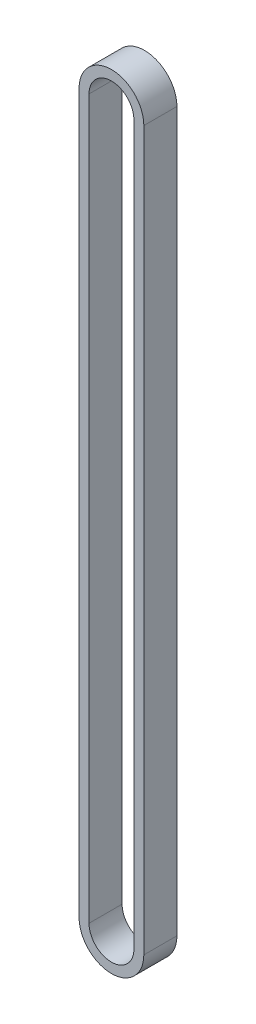
ISO-10303-21;
HEADER;
FILE_DESCRIPTION(('STEP AP214'),'2;1');
FILE_NAME('part.step','',(''),(''),'','','');
FILE_SCHEMA(('AUTOMOTIVE_DESIGN { 1 0 10303 214 1 1 1 1 }'));
ENDSEC;
DATA;
#1=APPLICATION_CONTEXT('core data for automotive mechanical design processes');
#2=APPLICATION_PROTOCOL_DEFINITION('international standard','automotive_design',2000,#1);
#3=PRODUCT_CONTEXT('',#1,'mechanical');
#4=PRODUCT('Part','Part','',(#3));
#5=PRODUCT_RELATED_PRODUCT_CATEGORY('part','',(#4));
#6=PRODUCT_DEFINITION_FORMATION('','',#4);
#7=PRODUCT_DEFINITION_CONTEXT('part definition',#1,'design');
#8=PRODUCT_DEFINITION('design','',#6,#7);
#9=PRODUCT_DEFINITION_SHAPE('','',#8);
#10=(LENGTH_UNIT() NAMED_UNIT(*) SI_UNIT(.MILLI.,.METRE.));
#11=(NAMED_UNIT(*) PLANE_ANGLE_UNIT() SI_UNIT($,.RADIAN.));
#12=(NAMED_UNIT(*) SI_UNIT($,.STERADIAN.) SOLID_ANGLE_UNIT());
#13=UNCERTAINTY_MEASURE_WITH_UNIT(LENGTH_MEASURE(1.E-05),#10,'distance_accuracy_value','');
#14=(GEOMETRIC_REPRESENTATION_CONTEXT(3) GLOBAL_UNCERTAINTY_ASSIGNED_CONTEXT((#13)) GLOBAL_UNIT_ASSIGNED_CONTEXT((#10,
#11,#12)) REPRESENTATION_CONTEXT('',''));
#15=CARTESIAN_POINT('',(0.,0.,0.));
#16=DIRECTION('',(0.,0.,1.));
#17=DIRECTION('',(1.,0.,0.));
#18=AXIS2_PLACEMENT_3D('',#15,#16,#17);
#19=CARTESIAN_POINT('',(0.,-108.5,10.));
#20=DIRECTION('',(0.,0.,1.));
#21=DIRECTION('',(1.,0.,0.));
#22=AXIS2_PLACEMENT_3D('',#19,#20,#21);
#23=PLANE('',#22);
#24=CARTESIAN_POINT('',(0.,-108.5,10.));
#25=DIRECTION('',(0.,0.,1.));
#26=DIRECTION('',(1.,0.,0.));
#27=AXIS2_PLACEMENT_3D('',#24,#25,#26);
#28=CIRCLE('',#27,9.78000000000004);
#29=CARTESIAN_POINT('',(-9.78000000000004,-108.5,10.));
#30=VERTEX_POINT('',#29);
#31=CARTESIAN_POINT('',(9.78000000000004,-108.5,10.));
#32=VERTEX_POINT('',#31);
#33=EDGE_CURVE('E141',#30,#32,#28,.T.);
#34=ORIENTED_EDGE('',*,*,#33,.T.);
#35=DIRECTION('',(0.,1.,0.));
#36=VECTOR('',#35,1.);
#37=CARTESIAN_POINT('',(9.78000000000004,-108.5,10.));
#38=LINE('',#37,#36);
#39=CARTESIAN_POINT('',(9.78000000000002,108.5,10.));
#40=VERTEX_POINT('',#39);
#41=EDGE_CURVE('E144',#32,#40,#38,.T.);
#42=ORIENTED_EDGE('',*,*,#41,.T.);
#43=CARTESIAN_POINT('',(0.,108.5,10.));
#44=DIRECTION('',(0.,0.,1.));
#45=DIRECTION('',(1.,0.,0.));
#46=AXIS2_PLACEMENT_3D('',#43,#44,#45);
#47=CIRCLE('',#46,9.78000000000002);
#48=CARTESIAN_POINT('',(-9.78000000000004,108.5,10.));
#49=VERTEX_POINT('',#48);
#50=EDGE_CURVE('E147',#40,#49,#47,.T.);
#51=ORIENTED_EDGE('',*,*,#50,.T.);
#52=DIRECTION('',(0.,-1.,0.));
#53=VECTOR('',#52,1.);
#54=CARTESIAN_POINT('',(-9.78000000000004,-108.5,10.));
#55=LINE('',#54,#53);
#56=EDGE_CURVE('E149',#49,#30,#55,.T.);
#57=ORIENTED_EDGE('',*,*,#56,.T.);
#58=EDGE_LOOP('',(#34,#42,#51,#57));
#59=FACE_BOUND('',#58,.T.);
#60=DIRECTION('',(0.,1.,0.));
#61=VECTOR('',#60,1.);
#62=CARTESIAN_POINT('',(6.78000000000004,-108.5,10.));
#63=LINE('',#62,#61);
#64=CARTESIAN_POINT('',(6.78000000000004,-108.5,10.));
#65=VERTEX_POINT('',#64);
#66=CARTESIAN_POINT('',(6.78000000000004,108.5,10.));
#67=VERTEX_POINT('',#66);
#68=EDGE_CURVE('E113',#65,#67,#63,.T.);
#69=ORIENTED_EDGE('',*,*,#68,.F.);
#70=CARTESIAN_POINT('',(0.,-108.5,10.));
#71=DIRECTION('',(0.,0.,1.));
#72=DIRECTION('',(1.,0.,0.));
#73=AXIS2_PLACEMENT_3D('',#70,#71,#72);
#74=CIRCLE('',#73,6.78000000000004);
#75=CARTESIAN_POINT('',(-6.78000000000004,-108.5,10.));
#76=VERTEX_POINT('',#75);
#77=EDGE_CURVE('E105',#76,#65,#74,.T.);
#78=ORIENTED_EDGE('',*,*,#77,.F.);
#79=DIRECTION('',(0.,-1.,0.));
#80=VECTOR('',#79,1.);
#81=CARTESIAN_POINT('',(-6.78000000000004,-108.5,10.));
#82=LINE('',#81,#80);
#83=CARTESIAN_POINT('',(-6.78000000000008,108.5,10.));
#84=VERTEX_POINT('',#83);
#85=EDGE_CURVE('E127',#84,#76,#82,.T.);
#86=ORIENTED_EDGE('',*,*,#85,.F.);
#87=CARTESIAN_POINT('',(0.,108.5,10.));
#88=DIRECTION('',(0.,0.,1.));
#89=DIRECTION('',(1.,0.,0.));
#90=AXIS2_PLACEMENT_3D('',#87,#88,#89);
#91=CIRCLE('',#90,6.78000000000004);
#92=EDGE_CURVE('E125',#67,#84,#91,.T.);
#93=ORIENTED_EDGE('',*,*,#92,.F.);
#94=EDGE_LOOP('',(#69,#78,#86,#93));
#95=FACE_BOUND('',#94,.T.);
#96=ADVANCED_FACE('F40',(#59,#95),#23,.T.);
#97=CARTESIAN_POINT('',(0.,-108.5,0.));
#98=DIRECTION('',(0.,0.,1.));
#99=DIRECTION('',(1.,0.,0.));
#100=AXIS2_PLACEMENT_3D('',#97,#98,#99);
#101=PLANE('',#100);
#102=CARTESIAN_POINT('',(0.,-108.5,0.));
#103=DIRECTION('',(0.,0.,1.));
#104=DIRECTION('',(1.,0.,0.));
#105=AXIS2_PLACEMENT_3D('',#102,#103,#104);
#106=CIRCLE('',#105,9.78000000000004);
#107=CARTESIAN_POINT('',(-9.78000000000004,-108.5,0.));
#108=VERTEX_POINT('',#107);
#109=CARTESIAN_POINT('',(9.78000000000004,-108.5,0.));
#110=VERTEX_POINT('',#109);
#111=EDGE_CURVE('E121',#108,#110,#106,.T.);
#112=ORIENTED_EDGE('',*,*,#111,.F.);
#113=DIRECTION('',(0.,-1.,0.));
#114=VECTOR('',#113,1.);
#115=CARTESIAN_POINT('',(-9.78000000000004,-108.5,0.));
#116=LINE('',#115,#114);
#117=CARTESIAN_POINT('',(-9.78000000000004,108.5,0.));
#118=VERTEX_POINT('',#117);
#119=EDGE_CURVE('E145',#118,#108,#116,.T.);
#120=ORIENTED_EDGE('',*,*,#119,.F.);
#121=CARTESIAN_POINT('',(0.,108.5,0.));
#122=DIRECTION('',(0.,0.,1.));
#123=DIRECTION('',(1.,0.,0.));
#124=AXIS2_PLACEMENT_3D('',#121,#122,#123);
#125=CIRCLE('',#124,9.78000000000002);
#126=CARTESIAN_POINT('',(9.78000000000002,108.5,0.));
#127=VERTEX_POINT('',#126);
#128=EDGE_CURVE('E156',#127,#118,#125,.T.);
#129=ORIENTED_EDGE('',*,*,#128,.F.);
#130=DIRECTION('',(0.,1.,0.));
#131=VECTOR('',#130,1.);
#132=CARTESIAN_POINT('',(9.78000000000004,-108.5,0.));
#133=LINE('',#132,#131);
#134=EDGE_CURVE('E154',#110,#127,#133,.T.);
#135=ORIENTED_EDGE('',*,*,#134,.F.);
#136=EDGE_LOOP('',(#112,#120,#129,#135));
#137=FACE_BOUND('',#136,.T.);
#138=CARTESIAN_POINT('',(0.,-108.5,0.));
#139=DIRECTION('',(0.,0.,1.));
#140=DIRECTION('',(1.,0.,0.));
#141=AXIS2_PLACEMENT_3D('',#138,#139,#140);
#142=CIRCLE('',#141,6.78000000000004);
#143=CARTESIAN_POINT('',(-6.78000000000004,-108.5,0.));
#144=VERTEX_POINT('',#143);
#145=CARTESIAN_POINT('',(6.78000000000004,-108.5,0.));
#146=VERTEX_POINT('',#145);
#147=EDGE_CURVE('E63',#144,#146,#142,.T.);
#148=ORIENTED_EDGE('',*,*,#147,.T.);
#149=DIRECTION('',(0.,1.,0.));
#150=VECTOR('',#149,1.);
#151=CARTESIAN_POINT('',(6.78000000000004,-108.5,0.));
#152=LINE('',#151,#150);
#153=CARTESIAN_POINT('',(6.78000000000004,108.5,0.));
#154=VERTEX_POINT('',#153);
#155=EDGE_CURVE('E120',#146,#154,#152,.T.);
#156=ORIENTED_EDGE('',*,*,#155,.T.);
#157=CARTESIAN_POINT('',(0.,108.5,0.));
#158=DIRECTION('',(0.,0.,1.));
#159=DIRECTION('',(1.,0.,0.));
#160=AXIS2_PLACEMENT_3D('',#157,#158,#159);
#161=CIRCLE('',#160,6.78000000000004);
#162=CARTESIAN_POINT('',(-6.78000000000008,108.5,0.));
#163=VERTEX_POINT('',#162);
#164=EDGE_CURVE('E133',#154,#163,#161,.T.);
#165=ORIENTED_EDGE('',*,*,#164,.T.);
#166=DIRECTION('',(0.,-1.,0.));
#167=VECTOR('',#166,1.);
#168=CARTESIAN_POINT('',(-6.78000000000004,-108.5,0.));
#169=LINE('',#168,#167);
#170=EDGE_CURVE('E114',#163,#144,#169,.T.);
#171=ORIENTED_EDGE('',*,*,#170,.T.);
#172=EDGE_LOOP('',(#148,#156,#165,#171));
#173=FACE_BOUND('',#172,.T.);
#174=ADVANCED_FACE('F174',(#137,#173),#101,.F.);
#175=CARTESIAN_POINT('',(0.,-108.5,10.));
#176=DIRECTION('',(0.,0.,-1.));
#177=DIRECTION('',(-1.,0.,0.));
#178=AXIS2_PLACEMENT_3D('',#175,#176,#177);
#179=CYLINDRICAL_SURFACE('',#178,9.78000000000004);
#180=ORIENTED_EDGE('',*,*,#111,.T.);
#181=DIRECTION('',(0.,0.,-1.));
#182=VECTOR('',#181,1.);
#183=CARTESIAN_POINT('',(9.78000000000004,-108.5,10.));
#184=LINE('',#183,#182);
#185=EDGE_CURVE('E11',#32,#110,#184,.T.);
#186=ORIENTED_EDGE('',*,*,#185,.F.);
#187=ORIENTED_EDGE('',*,*,#33,.F.);
#188=DIRECTION('',(0.,0.,-1.));
#189=VECTOR('',#188,1.);
#190=CARTESIAN_POINT('',(-9.78000000000004,-108.5,10.));
#191=LINE('',#190,#189);
#192=EDGE_CURVE('E151',#30,#108,#191,.T.);
#193=ORIENTED_EDGE('',*,*,#192,.T.);
#194=EDGE_LOOP('',(#180,#186,#187,#193));
#195=FACE_BOUND('',#194,.T.);
#196=ADVANCED_FACE('F42',(#195),#179,.T.);
#197=CARTESIAN_POINT('',(9.78000000000004,-108.5,10.));
#198=DIRECTION('',(-1.,0.,0.));
#199=DIRECTION('',(0.,-1.,0.));
#200=AXIS2_PLACEMENT_3D('',#197,#198,#199);
#201=PLANE('',#200);
#202=ORIENTED_EDGE('',*,*,#134,.T.);
#203=DIRECTION('',(0.,0.,-1.));
#204=VECTOR('',#203,1.);
#205=CARTESIAN_POINT('',(9.78000000000002,108.5,10.));
#206=LINE('',#205,#204);
#207=EDGE_CURVE('E48',#40,#127,#206,.T.);
#208=ORIENTED_EDGE('',*,*,#207,.F.);
#209=ORIENTED_EDGE('',*,*,#41,.F.);
#210=ORIENTED_EDGE('',*,*,#185,.T.);
#211=EDGE_LOOP('',(#202,#208,#209,#210));
#212=FACE_BOUND('',#211,.T.);
#213=ADVANCED_FACE('F184',(#212),#201,.F.);
#214=CARTESIAN_POINT('',(0.,108.5,10.));
#215=DIRECTION('',(0.,0.,-1.));
#216=DIRECTION('',(-1.,0.,0.));
#217=AXIS2_PLACEMENT_3D('',#214,#215,#216);
#218=CYLINDRICAL_SURFACE('',#217,9.78000000000002);
#219=ORIENTED_EDGE('',*,*,#128,.T.);
#220=DIRECTION('',(0.,0.,-1.));
#221=VECTOR('',#220,1.);
#222=CARTESIAN_POINT('',(-9.78000000000004,108.5,10.));
#223=LINE('',#222,#221);
#224=EDGE_CURVE('E161',#49,#118,#223,.T.);
#225=ORIENTED_EDGE('',*,*,#224,.F.);
#226=ORIENTED_EDGE('',*,*,#50,.F.);
#227=ORIENTED_EDGE('',*,*,#207,.T.);
#228=EDGE_LOOP('',(#219,#225,#226,#227));
#229=FACE_BOUND('',#228,.T.);
#230=ADVANCED_FACE('F168',(#229),#218,.T.);
#231=CARTESIAN_POINT('',(-9.78000000000004,-108.5,10.));
#232=DIRECTION('',(1.,0.,0.));
#233=DIRECTION('',(0.,0.,-1.));
#234=AXIS2_PLACEMENT_3D('',#231,#232,#233);
#235=PLANE('',#234);
#236=ORIENTED_EDGE('',*,*,#119,.T.);
#237=ORIENTED_EDGE('',*,*,#192,.F.);
#238=ORIENTED_EDGE('',*,*,#56,.F.);
#239=ORIENTED_EDGE('',*,*,#224,.T.);
#240=EDGE_LOOP('',(#236,#237,#238,#239));
#241=FACE_BOUND('',#240,.T.);
#242=ADVANCED_FACE('F178',(#241),#235,.F.);
#243=CARTESIAN_POINT('',(0.,-108.5,10.));
#244=DIRECTION('',(0.,0.,-1.));
#245=DIRECTION('',(-1.,0.,0.));
#246=AXIS2_PLACEMENT_3D('',#243,#244,#245);
#247=CYLINDRICAL_SURFACE('',#246,6.78000000000004);
#248=ORIENTED_EDGE('',*,*,#147,.F.);
#249=DIRECTION('',(0.,0.,-1.));
#250=VECTOR('',#249,1.);
#251=CARTESIAN_POINT('',(-6.78000000000004,-108.5,10.));
#252=LINE('',#251,#250);
#253=EDGE_CURVE('E109',#76,#144,#252,.T.);
#254=ORIENTED_EDGE('',*,*,#253,.F.);
#255=ORIENTED_EDGE('',*,*,#77,.T.);
#256=DIRECTION('',(0.,0.,-1.));
#257=VECTOR('',#256,1.);
#258=CARTESIAN_POINT('',(6.78000000000004,-108.5,10.));
#259=LINE('',#258,#257);
#260=EDGE_CURVE('E108',#65,#146,#259,.T.);
#261=ORIENTED_EDGE('',*,*,#260,.T.);
#262=EDGE_LOOP('',(#248,#254,#255,#261));
#263=FACE_BOUND('',#262,.T.);
#264=ADVANCED_FACE('F107',(#263),#247,.F.);
#265=CARTESIAN_POINT('',(6.78000000000004,-108.5,10.));
#266=DIRECTION('',(-1.,0.,0.));
#267=DIRECTION('',(0.,-1.,0.));
#268=AXIS2_PLACEMENT_3D('',#265,#266,#267);
#269=PLANE('',#268);
#270=ORIENTED_EDGE('',*,*,#155,.F.);
#271=ORIENTED_EDGE('',*,*,#260,.F.);
#272=ORIENTED_EDGE('',*,*,#68,.T.);
#273=DIRECTION('',(0.,0.,-1.));
#274=VECTOR('',#273,1.);
#275=CARTESIAN_POINT('',(6.78000000000004,108.5,10.));
#276=LINE('',#275,#274);
#277=EDGE_CURVE('E122',#67,#154,#276,.T.);
#278=ORIENTED_EDGE('',*,*,#277,.T.);
#279=EDGE_LOOP('',(#270,#271,#272,#278));
#280=FACE_BOUND('',#279,.T.);
#281=ADVANCED_FACE('F117',(#280),#269,.T.);
#282=CARTESIAN_POINT('',(0.,108.5,10.));
#283=DIRECTION('',(0.,0.,-1.));
#284=DIRECTION('',(-1.,0.,0.));
#285=AXIS2_PLACEMENT_3D('',#282,#283,#284);
#286=CYLINDRICAL_SURFACE('',#285,6.78000000000004);
#287=ORIENTED_EDGE('',*,*,#164,.F.);
#288=ORIENTED_EDGE('',*,*,#277,.F.);
#289=ORIENTED_EDGE('',*,*,#92,.T.);
#290=DIRECTION('',(0.,0.,-1.));
#291=VECTOR('',#290,1.);
#292=CARTESIAN_POINT('',(-6.78000000000008,108.5,10.));
#293=LINE('',#292,#291);
#294=EDGE_CURVE('E55',#84,#163,#293,.T.);
#295=ORIENTED_EDGE('',*,*,#294,.T.);
#296=EDGE_LOOP('',(#287,#288,#289,#295));
#297=FACE_BOUND('',#296,.T.);
#298=ADVANCED_FACE('F207',(#297),#286,.F.);
#299=CARTESIAN_POINT('',(-6.78000000000004,-108.5,10.));
#300=DIRECTION('',(1.,0.,0.));
#301=DIRECTION('',(0.,1.,0.));
#302=AXIS2_PLACEMENT_3D('',#299,#300,#301);
#303=PLANE('',#302);
#304=ORIENTED_EDGE('',*,*,#170,.F.);
#305=ORIENTED_EDGE('',*,*,#294,.F.);
#306=ORIENTED_EDGE('',*,*,#85,.T.);
#307=ORIENTED_EDGE('',*,*,#253,.T.);
#308=EDGE_LOOP('',(#304,#305,#306,#307));
#309=FACE_BOUND('',#308,.T.);
#310=ADVANCED_FACE('F211',(#309),#303,.T.);
#311=CLOSED_SHELL('',(#96,#174,#196,#213,#230,#242,#264,#281,#298,#310));
#312=MANIFOLD_SOLID_BREP('B2',#311);
#313=ADVANCED_BREP_SHAPE_REPRESENTATION('',(#18,#312),#14);
#314=SHAPE_DEFINITION_REPRESENTATION(#9,#313);
ENDSEC;
END-ISO-10303-21;
